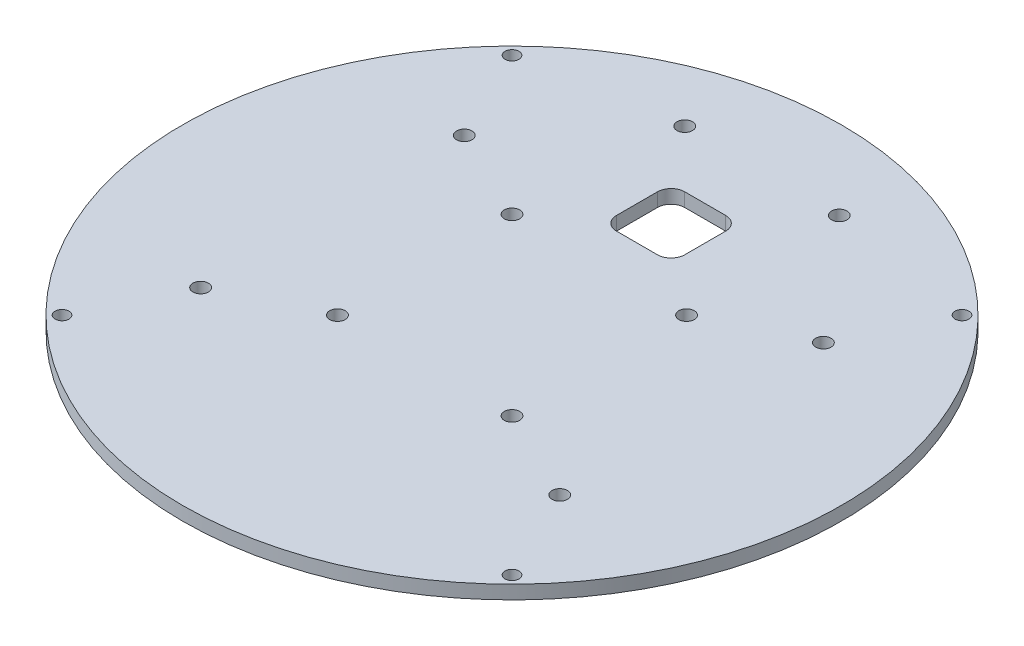
ISO-10303-21;
HEADER;
FILE_DESCRIPTION(('STEP AP214'),'2;1');
FILE_NAME('part.step','',(''),(''),'','','');
FILE_SCHEMA(('AUTOMOTIVE_DESIGN { 1 0 10303 214 1 1 1 1 }'));
ENDSEC;
DATA;
#1=APPLICATION_CONTEXT('core data for automotive mechanical design processes');
#2=APPLICATION_PROTOCOL_DEFINITION('international standard','automotive_design',2000,#1);
#3=PRODUCT_CONTEXT('',#1,'mechanical');
#4=PRODUCT('Part','Part','',(#3));
#5=PRODUCT_RELATED_PRODUCT_CATEGORY('part','',(#4));
#6=PRODUCT_DEFINITION_FORMATION('','',#4);
#7=PRODUCT_DEFINITION_CONTEXT('part definition',#1,'design');
#8=PRODUCT_DEFINITION('design','',#6,#7);
#9=PRODUCT_DEFINITION_SHAPE('','',#8);
#10=(LENGTH_UNIT() NAMED_UNIT(*) SI_UNIT(.MILLI.,.METRE.));
#11=(NAMED_UNIT(*) PLANE_ANGLE_UNIT() SI_UNIT($,.RADIAN.));
#12=(NAMED_UNIT(*) SI_UNIT($,.STERADIAN.) SOLID_ANGLE_UNIT());
#13=UNCERTAINTY_MEASURE_WITH_UNIT(LENGTH_MEASURE(1.E-05),#10,'distance_accuracy_value','');
#14=(GEOMETRIC_REPRESENTATION_CONTEXT(3) GLOBAL_UNCERTAINTY_ASSIGNED_CONTEXT((#13)) GLOBAL_UNIT_ASSIGNED_CONTEXT((#10,
#11,#12)) REPRESENTATION_CONTEXT('',''));
#15=CARTESIAN_POINT('',(0.,0.,0.));
#16=DIRECTION('',(0.,0.,1.));
#17=DIRECTION('',(1.,0.,0.));
#18=AXIS2_PLACEMENT_3D('',#15,#16,#17);
#19=CARTESIAN_POINT('',(0.,3.,0.));
#20=DIRECTION('',(0.,1.,0.));
#21=DIRECTION('',(0.,0.,1.));
#22=AXIS2_PLACEMENT_3D('',#19,#20,#21);
#23=PLANE('',#22);
#24=CARTESIAN_POINT('',(19.2,3.,19.2000000000001));
#25=DIRECTION('',(0.,1.,0.));
#26=DIRECTION('',(0.,0.,1.));
#27=AXIS2_PLACEMENT_3D('',#24,#25,#26);
#28=CIRCLE('',#27,1.70000000000013);
#29=CARTESIAN_POINT('',(19.2,3.,20.9000000000003));
#30=VERTEX_POINT('',#29);
#31=EDGE_CURVE('E176',#30,#30,#28,.T.);
#32=ORIENTED_EDGE('',*,*,#31,.F.);
#33=EDGE_LOOP('',(#32));
#34=FACE_BOUND('',#33,.T.);
#35=CARTESIAN_POINT('',(-19.2,3.,-19.2));
#36=DIRECTION('',(0.,1.,0.));
#37=DIRECTION('',(0.,0.,1.));
#38=AXIS2_PLACEMENT_3D('',#35,#36,#37);
#39=CIRCLE('',#38,1.7);
#40=CARTESIAN_POINT('',(-19.2,3.,-17.5));
#41=VERTEX_POINT('',#40);
#42=EDGE_CURVE('E188',#41,#41,#39,.T.);
#43=ORIENTED_EDGE('',*,*,#42,.F.);
#44=EDGE_LOOP('',(#43));
#45=FACE_BOUND('',#44,.T.);
#46=CARTESIAN_POINT('',(-39.4999999999994,3.,29.));
#47=DIRECTION('',(0.,1.,0.));
#48=DIRECTION('',(0.,0.,1.));
#49=AXIS2_PLACEMENT_3D('',#46,#47,#48);
#50=CIRCLE('',#49,1.7);
#51=CARTESIAN_POINT('',(-39.4999999999994,3.,30.7));
#52=VERTEX_POINT('',#51);
#53=EDGE_CURVE('E200',#52,#52,#50,.T.);
#54=ORIENTED_EDGE('',*,*,#53,.F.);
#55=EDGE_LOOP('',(#54));
#56=FACE_BOUND('',#55,.T.);
#57=CARTESIAN_POINT('',(39.5,3.,-29.));
#58=DIRECTION('',(0.,1.,0.));
#59=DIRECTION('',(0.,0.,1.));
#60=AXIS2_PLACEMENT_3D('',#57,#58,#59);
#61=CIRCLE('',#60,1.7);
#62=CARTESIAN_POINT('',(39.5,3.,-27.3));
#63=VERTEX_POINT('',#62);
#64=EDGE_CURVE('E212',#63,#63,#61,.T.);
#65=ORIENTED_EDGE('',*,*,#64,.F.);
#66=EDGE_LOOP('',(#65));
#67=FACE_BOUND('',#66,.T.);
#68=CARTESIAN_POINT('',(-39.5,3.,-29.));
#69=DIRECTION('',(0.,1.,0.));
#70=DIRECTION('',(0.,0.,1.));
#71=AXIS2_PLACEMENT_3D('',#68,#69,#70);
#72=CIRCLE('',#71,1.7);
#73=CARTESIAN_POINT('',(-39.5,3.,-27.3));
#74=VERTEX_POINT('',#73);
#75=EDGE_CURVE('E224',#74,#74,#72,.T.);
#76=ORIENTED_EDGE('',*,*,#75,.F.);
#77=EDGE_LOOP('',(#76));
#78=FACE_BOUND('',#77,.T.);
#79=CARTESIAN_POINT('',(49.4974746830589,3.,-49.4974746830577));
#80=DIRECTION('',(0.,1.,0.));
#81=DIRECTION('',(0.,0.,1.));
#82=AXIS2_PLACEMENT_3D('',#79,#80,#81);
#83=CIRCLE('',#82,1.53125044274189);
#84=CARTESIAN_POINT('',(49.4974746830589,3.,-47.9662242403159));
#85=VERTEX_POINT('',#84);
#86=EDGE_CURVE('E236',#85,#85,#83,.T.);
#87=ORIENTED_EDGE('',*,*,#86,.F.);
#88=EDGE_LOOP('',(#87));
#89=FACE_BOUND('',#88,.T.);
#90=CARTESIAN_POINT('',(-49.4974746830589,3.,49.4974746830577));
#91=DIRECTION('',(0.,1.,0.));
#92=DIRECTION('',(0.,0.,1.));
#93=AXIS2_PLACEMENT_3D('',#90,#91,#92);
#94=CIRCLE('',#93,1.53125044274189);
#95=CARTESIAN_POINT('',(-49.4974746830589,3.,51.0287251257996));
#96=VERTEX_POINT('',#95);
#97=EDGE_CURVE('E248',#96,#96,#94,.T.);
#98=ORIENTED_EDGE('',*,*,#97,.F.);
#99=EDGE_LOOP('',(#98));
#100=FACE_BOUND('',#99,.T.);
#101=CARTESIAN_POINT('',(0.,3.,0.));
#102=DIRECTION('',(0.,1.,0.));
#103=DIRECTION('',(0.,0.,1.));
#104=AXIS2_PLACEMENT_3D('',#101,#102,#103);
#105=CIRCLE('',#104,72.5);
#106=CARTESIAN_POINT('',(0.,3.,72.5));
#107=VERTEX_POINT('',#106);
#108=EDGE_CURVE('E11',#107,#107,#105,.T.);
#109=ORIENTED_EDGE('',*,*,#108,.T.);
#110=EDGE_LOOP('',(#109));
#111=FACE_BOUND('',#110,.T.);
#112=CARTESIAN_POINT('',(-49.4974746830577,3.,-49.4974746830589));
#113=DIRECTION('',(0.,1.,0.));
#114=DIRECTION('',(0.,0.,1.));
#115=AXIS2_PLACEMENT_3D('',#112,#113,#114);
#116=CIRCLE('',#115,1.53125044274189);
#117=CARTESIAN_POINT('',(-49.4974746830577,3.,-47.966224240317));
#118=VERTEX_POINT('',#117);
#119=EDGE_CURVE('E242',#118,#118,#116,.T.);
#120=ORIENTED_EDGE('',*,*,#119,.F.);
#121=EDGE_LOOP('',(#120));
#122=FACE_BOUND('',#121,.T.);
#123=CARTESIAN_POINT('',(49.4974746830577,3.,49.4974746830589));
#124=DIRECTION('',(0.,1.,0.));
#125=DIRECTION('',(0.,0.,1.));
#126=AXIS2_PLACEMENT_3D('',#123,#124,#125);
#127=CIRCLE('',#126,1.53125044274189);
#128=CARTESIAN_POINT('',(49.4974746830577,3.,51.0287251258008));
#129=VERTEX_POINT('',#128);
#130=EDGE_CURVE('E230',#129,#129,#127,.T.);
#131=ORIENTED_EDGE('',*,*,#130,.F.);
#132=EDGE_LOOP('',(#131));
#133=FACE_BOUND('',#132,.T.);
#134=CARTESIAN_POINT('',(-17.,3.,-55.));
#135=DIRECTION('',(0.,1.,0.));
#136=DIRECTION('',(0.,0.,1.));
#137=AXIS2_PLACEMENT_3D('',#134,#135,#136);
#138=CIRCLE('',#137,1.7);
#139=CARTESIAN_POINT('',(-17.,3.,-53.3));
#140=VERTEX_POINT('',#139);
#141=EDGE_CURVE('E218',#140,#140,#138,.T.);
#142=ORIENTED_EDGE('',*,*,#141,.F.);
#143=EDGE_LOOP('',(#142));
#144=FACE_BOUND('',#143,.T.);
#145=CARTESIAN_POINT('',(39.5000000000006,3.,29.));
#146=DIRECTION('',(0.,1.,0.));
#147=DIRECTION('',(0.,0.,1.));
#148=AXIS2_PLACEMENT_3D('',#145,#146,#147);
#149=CIRCLE('',#148,1.7);
#150=CARTESIAN_POINT('',(39.5000000000006,3.,30.7));
#151=VERTEX_POINT('',#150);
#152=EDGE_CURVE('E206',#151,#151,#149,.T.);
#153=ORIENTED_EDGE('',*,*,#152,.F.);
#154=EDGE_LOOP('',(#153));
#155=FACE_BOUND('',#154,.T.);
#156=CARTESIAN_POINT('',(16.9999999999999,3.,-55.));
#157=DIRECTION('',(0.,1.,0.));
#158=DIRECTION('',(0.,0.,1.));
#159=AXIS2_PLACEMENT_3D('',#156,#157,#158);
#160=CIRCLE('',#159,1.7);
#161=CARTESIAN_POINT('',(16.9999999999999,3.,-53.3));
#162=VERTEX_POINT('',#161);
#163=EDGE_CURVE('E194',#162,#162,#160,.T.);
#164=ORIENTED_EDGE('',*,*,#163,.F.);
#165=EDGE_LOOP('',(#164));
#166=FACE_BOUND('',#165,.T.);
#167=CARTESIAN_POINT('',(19.2000000000001,3.,-19.1999999999999));
#168=DIRECTION('',(0.,1.,0.));
#169=DIRECTION('',(0.,0.,1.));
#170=AXIS2_PLACEMENT_3D('',#167,#168,#169);
#171=CIRCLE('',#170,1.7);
#172=CARTESIAN_POINT('',(19.2000000000001,3.,-17.4999999999999));
#173=VERTEX_POINT('',#172);
#174=EDGE_CURVE('E182',#173,#173,#171,.T.);
#175=ORIENTED_EDGE('',*,*,#174,.F.);
#176=EDGE_LOOP('',(#175));
#177=FACE_BOUND('',#176,.T.);
#178=CARTESIAN_POINT('',(-19.2000000000002,3.,19.1999999999998));
#179=DIRECTION('',(0.,1.,0.));
#180=DIRECTION('',(0.,0.,1.));
#181=AXIS2_PLACEMENT_3D('',#178,#179,#180);
#182=CIRCLE('',#181,1.7);
#183=CARTESIAN_POINT('',(-19.2000000000002,3.,20.8999999999998));
#184=VERTEX_POINT('',#183);
#185=EDGE_CURVE('E170',#184,#184,#182,.T.);
#186=ORIENTED_EDGE('',*,*,#185,.F.);
#187=EDGE_LOOP('',(#186));
#188=FACE_BOUND('',#187,.T.);
#189=DIRECTION('',(0.,0.,1.));
#190=VECTOR('',#189,1.);
#191=CARTESIAN_POINT('',(-7.50000000000001,3.,-39.5));
#192=LINE('',#191,#190);
#193=CARTESIAN_POINT('',(-7.50000000000001,3.,-39.5));
#194=VERTEX_POINT('',#193);
#195=CARTESIAN_POINT('',(-7.50000000000001,3.,-30.5));
#196=VERTEX_POINT('',#195);
#197=EDGE_CURVE('E113',#194,#196,#192,.T.);
#198=ORIENTED_EDGE('',*,*,#197,.F.);
#199=CARTESIAN_POINT('',(-4.50000000000001,3.,-39.5));
#200=DIRECTION('',(0.,1.,0.));
#201=DIRECTION('',(0.,0.,1.));
#202=AXIS2_PLACEMENT_3D('',#199,#200,#201);
#203=CIRCLE('',#202,3.);
#204=CARTESIAN_POINT('',(-4.50000000000001,3.,-42.5));
#205=VERTEX_POINT('',#204);
#206=EDGE_CURVE('E105',#205,#194,#203,.T.);
#207=ORIENTED_EDGE('',*,*,#206,.F.);
#208=DIRECTION('',(-1.,0.,0.));
#209=VECTOR('',#208,1.);
#210=CARTESIAN_POINT('',(-4.50000000000001,3.,-42.5));
#211=LINE('',#210,#209);
#212=CARTESIAN_POINT('',(4.49999999999999,3.,-42.5));
#213=VERTEX_POINT('',#212);
#214=EDGE_CURVE('E138',#213,#205,#211,.T.);
#215=ORIENTED_EDGE('',*,*,#214,.F.);
#216=CARTESIAN_POINT('',(4.49999999999999,3.,-39.5));
#217=DIRECTION('',(0.,1.,0.));
#218=DIRECTION('',(0.,0.,1.));
#219=AXIS2_PLACEMENT_3D('',#216,#217,#218);
#220=CIRCLE('',#219,3.);
#221=CARTESIAN_POINT('',(7.49999999999999,3.,-39.5));
#222=VERTEX_POINT('',#221);
#223=EDGE_CURVE('E136',#222,#213,#220,.T.);
#224=ORIENTED_EDGE('',*,*,#223,.F.);
#225=DIRECTION('',(0.,0.,-1.));
#226=VECTOR('',#225,1.);
#227=CARTESIAN_POINT('',(7.49999999999999,3.,-39.5));
#228=LINE('',#227,#226);
#229=CARTESIAN_POINT('',(7.49999999999999,3.,-30.5));
#230=VERTEX_POINT('',#229);
#231=EDGE_CURVE('E134',#230,#222,#228,.T.);
#232=ORIENTED_EDGE('',*,*,#231,.F.);
#233=CARTESIAN_POINT('',(4.49999999999999,3.,-30.5));
#234=DIRECTION('',(0.,1.,0.));
#235=DIRECTION('',(0.,0.,-1.));
#236=AXIS2_PLACEMENT_3D('',#233,#234,#235);
#237=CIRCLE('',#236,3.);
#238=CARTESIAN_POINT('',(4.49999999999999,3.,-27.5));
#239=VERTEX_POINT('',#238);
#240=EDGE_CURVE('E132',#239,#230,#237,.T.);
#241=ORIENTED_EDGE('',*,*,#240,.F.);
#242=DIRECTION('',(1.,0.,0.));
#243=VECTOR('',#242,1.);
#244=CARTESIAN_POINT('',(-4.50000000000001,3.,-27.5));
#245=LINE('',#244,#243);
#246=CARTESIAN_POINT('',(-4.50000000000001,3.,-27.5));
#247=VERTEX_POINT('',#246);
#248=EDGE_CURVE('E128',#247,#239,#245,.T.);
#249=ORIENTED_EDGE('',*,*,#248,.F.);
#250=CARTESIAN_POINT('',(-4.50000000000001,3.,-30.5));
#251=DIRECTION('',(0.,1.,0.));
#252=DIRECTION('',(0.,0.,1.));
#253=AXIS2_PLACEMENT_3D('',#250,#251,#252);
#254=CIRCLE('',#253,3.);
#255=EDGE_CURVE('E126',#196,#247,#254,.T.);
#256=ORIENTED_EDGE('',*,*,#255,.F.);
#257=EDGE_LOOP('',(#198,#207,#215,#224,#232,#241,#249,#256));
#258=FACE_BOUND('',#257,.T.);
#259=ADVANCED_FACE('F40',(#34,#45,#56,#67,#78,#89,#100,#111,#122,#133,#144,#155,#166,#177,#188,
#258),#23,.T.);
#260=CARTESIAN_POINT('',(0.,0.,0.));
#261=DIRECTION('',(0.,1.,0.));
#262=DIRECTION('',(0.,0.,1.));
#263=AXIS2_PLACEMENT_3D('',#260,#261,#262);
#264=PLANE('',#263);
#265=CARTESIAN_POINT('',(-19.2000000000002,0.,19.1999999999998));
#266=DIRECTION('',(0.,1.,0.));
#267=DIRECTION('',(0.,0.,1.));
#268=AXIS2_PLACEMENT_3D('',#265,#266,#267);
#269=CIRCLE('',#268,1.7);
#270=CARTESIAN_POINT('',(-19.2000000000002,0.,20.8999999999998));
#271=VERTEX_POINT('',#270);
#272=EDGE_CURVE('E121',#271,#271,#269,.T.);
#273=ORIENTED_EDGE('',*,*,#272,.T.);
#274=EDGE_LOOP('',(#273));
#275=FACE_BOUND('',#274,.T.);
#276=CARTESIAN_POINT('',(19.2,0.,19.2000000000001));
#277=DIRECTION('',(0.,1.,0.));
#278=DIRECTION('',(0.,0.,1.));
#279=AXIS2_PLACEMENT_3D('',#276,#277,#278);
#280=CIRCLE('',#279,1.70000000000013);
#281=CARTESIAN_POINT('',(19.2,0.,20.9000000000003));
#282=VERTEX_POINT('',#281);
#283=EDGE_CURVE('E173',#282,#282,#280,.T.);
#284=ORIENTED_EDGE('',*,*,#283,.T.);
#285=EDGE_LOOP('',(#284));
#286=FACE_BOUND('',#285,.T.);
#287=CARTESIAN_POINT('',(19.2000000000001,0.,-19.1999999999999));
#288=DIRECTION('',(0.,1.,0.));
#289=DIRECTION('',(0.,0.,1.));
#290=AXIS2_PLACEMENT_3D('',#287,#288,#289);
#291=CIRCLE('',#290,1.7);
#292=CARTESIAN_POINT('',(19.2000000000001,0.,-17.4999999999999));
#293=VERTEX_POINT('',#292);
#294=EDGE_CURVE('E179',#293,#293,#291,.T.);
#295=ORIENTED_EDGE('',*,*,#294,.T.);
#296=EDGE_LOOP('',(#295));
#297=FACE_BOUND('',#296,.T.);
#298=CARTESIAN_POINT('',(-19.2,0.,-19.2));
#299=DIRECTION('',(0.,1.,0.));
#300=DIRECTION('',(0.,0.,1.));
#301=AXIS2_PLACEMENT_3D('',#298,#299,#300);
#302=CIRCLE('',#301,1.7);
#303=CARTESIAN_POINT('',(-19.2,0.,-17.5));
#304=VERTEX_POINT('',#303);
#305=EDGE_CURVE('E185',#304,#304,#302,.T.);
#306=ORIENTED_EDGE('',*,*,#305,.T.);
#307=EDGE_LOOP('',(#306));
#308=FACE_BOUND('',#307,.T.);
#309=CARTESIAN_POINT('',(16.9999999999999,0.,-55.));
#310=DIRECTION('',(0.,1.,0.));
#311=DIRECTION('',(0.,0.,1.));
#312=AXIS2_PLACEMENT_3D('',#309,#310,#311);
#313=CIRCLE('',#312,1.7);
#314=CARTESIAN_POINT('',(16.9999999999999,0.,-53.3));
#315=VERTEX_POINT('',#314);
#316=EDGE_CURVE('E191',#315,#315,#313,.T.);
#317=ORIENTED_EDGE('',*,*,#316,.T.);
#318=EDGE_LOOP('',(#317));
#319=FACE_BOUND('',#318,.T.);
#320=CARTESIAN_POINT('',(-39.4999999999994,0.,29.));
#321=DIRECTION('',(0.,1.,0.));
#322=DIRECTION('',(0.,0.,1.));
#323=AXIS2_PLACEMENT_3D('',#320,#321,#322);
#324=CIRCLE('',#323,1.7);
#325=CARTESIAN_POINT('',(-39.4999999999994,0.,30.7));
#326=VERTEX_POINT('',#325);
#327=EDGE_CURVE('E197',#326,#326,#324,.T.);
#328=ORIENTED_EDGE('',*,*,#327,.T.);
#329=EDGE_LOOP('',(#328));
#330=FACE_BOUND('',#329,.T.);
#331=CARTESIAN_POINT('',(39.5000000000006,0.,29.));
#332=DIRECTION('',(0.,1.,0.));
#333=DIRECTION('',(0.,0.,1.));
#334=AXIS2_PLACEMENT_3D('',#331,#332,#333);
#335=CIRCLE('',#334,1.7);
#336=CARTESIAN_POINT('',(39.5000000000006,0.,30.7));
#337=VERTEX_POINT('',#336);
#338=EDGE_CURVE('E203',#337,#337,#335,.T.);
#339=ORIENTED_EDGE('',*,*,#338,.T.);
#340=EDGE_LOOP('',(#339));
#341=FACE_BOUND('',#340,.T.);
#342=CARTESIAN_POINT('',(39.5,0.,-29.));
#343=DIRECTION('',(0.,1.,0.));
#344=DIRECTION('',(0.,0.,1.));
#345=AXIS2_PLACEMENT_3D('',#342,#343,#344);
#346=CIRCLE('',#345,1.7);
#347=CARTESIAN_POINT('',(39.5,0.,-27.3));
#348=VERTEX_POINT('',#347);
#349=EDGE_CURVE('E209',#348,#348,#346,.T.);
#350=ORIENTED_EDGE('',*,*,#349,.T.);
#351=EDGE_LOOP('',(#350));
#352=FACE_BOUND('',#351,.T.);
#353=CARTESIAN_POINT('',(-17.,0.,-55.));
#354=DIRECTION('',(0.,1.,0.));
#355=DIRECTION('',(0.,0.,1.));
#356=AXIS2_PLACEMENT_3D('',#353,#354,#355);
#357=CIRCLE('',#356,1.7);
#358=CARTESIAN_POINT('',(-17.,0.,-53.3));
#359=VERTEX_POINT('',#358);
#360=EDGE_CURVE('E215',#359,#359,#357,.T.);
#361=ORIENTED_EDGE('',*,*,#360,.T.);
#362=EDGE_LOOP('',(#361));
#363=FACE_BOUND('',#362,.T.);
#364=CARTESIAN_POINT('',(-39.5,0.,-29.));
#365=DIRECTION('',(0.,1.,0.));
#366=DIRECTION('',(0.,0.,1.));
#367=AXIS2_PLACEMENT_3D('',#364,#365,#366);
#368=CIRCLE('',#367,1.7);
#369=CARTESIAN_POINT('',(-39.5,0.,-27.3));
#370=VERTEX_POINT('',#369);
#371=EDGE_CURVE('E221',#370,#370,#368,.T.);
#372=ORIENTED_EDGE('',*,*,#371,.T.);
#373=EDGE_LOOP('',(#372));
#374=FACE_BOUND('',#373,.T.);
#375=CARTESIAN_POINT('',(49.4974746830577,0.,49.4974746830589));
#376=DIRECTION('',(0.,1.,0.));
#377=DIRECTION('',(0.,0.,1.));
#378=AXIS2_PLACEMENT_3D('',#375,#376,#377);
#379=CIRCLE('',#378,1.53125044274189);
#380=CARTESIAN_POINT('',(49.4974746830577,0.,51.0287251258008));
#381=VERTEX_POINT('',#380);
#382=EDGE_CURVE('E227',#381,#381,#379,.T.);
#383=ORIENTED_EDGE('',*,*,#382,.T.);
#384=EDGE_LOOP('',(#383));
#385=FACE_BOUND('',#384,.T.);
#386=CARTESIAN_POINT('',(49.4974746830589,0.,-49.4974746830577));
#387=DIRECTION('',(0.,1.,0.));
#388=DIRECTION('',(0.,0.,1.));
#389=AXIS2_PLACEMENT_3D('',#386,#387,#388);
#390=CIRCLE('',#389,1.53125044274189);
#391=CARTESIAN_POINT('',(49.4974746830589,0.,-47.9662242403159));
#392=VERTEX_POINT('',#391);
#393=EDGE_CURVE('E233',#392,#392,#390,.T.);
#394=ORIENTED_EDGE('',*,*,#393,.T.);
#395=EDGE_LOOP('',(#394));
#396=FACE_BOUND('',#395,.T.);
#397=CARTESIAN_POINT('',(-49.4974746830577,0.,-49.4974746830589));
#398=DIRECTION('',(0.,1.,0.));
#399=DIRECTION('',(0.,0.,1.));
#400=AXIS2_PLACEMENT_3D('',#397,#398,#399);
#401=CIRCLE('',#400,1.53125044274189);
#402=CARTESIAN_POINT('',(-49.4974746830577,0.,-47.966224240317));
#403=VERTEX_POINT('',#402);
#404=EDGE_CURVE('E239',#403,#403,#401,.T.);
#405=ORIENTED_EDGE('',*,*,#404,.T.);
#406=EDGE_LOOP('',(#405));
#407=FACE_BOUND('',#406,.T.);
#408=CARTESIAN_POINT('',(-49.4974746830589,0.,49.4974746830577));
#409=DIRECTION('',(0.,1.,0.));
#410=DIRECTION('',(0.,0.,1.));
#411=AXIS2_PLACEMENT_3D('',#408,#409,#410);
#412=CIRCLE('',#411,1.53125044274189);
#413=CARTESIAN_POINT('',(-49.4974746830589,0.,51.0287251257996));
#414=VERTEX_POINT('',#413);
#415=EDGE_CURVE('E245',#414,#414,#412,.T.);
#416=ORIENTED_EDGE('',*,*,#415,.T.);
#417=EDGE_LOOP('',(#416));
#418=FACE_BOUND('',#417,.T.);
#419=CARTESIAN_POINT('',(0.,0.,0.));
#420=DIRECTION('',(0.,1.,0.));
#421=DIRECTION('',(0.,0.,1.));
#422=AXIS2_PLACEMENT_3D('',#419,#420,#421);
#423=CIRCLE('',#422,72.5);
#424=CARTESIAN_POINT('',(0.,0.,72.5));
#425=VERTEX_POINT('',#424);
#426=EDGE_CURVE('E44',#425,#425,#423,.T.);
#427=ORIENTED_EDGE('',*,*,#426,.F.);
#428=EDGE_LOOP('',(#427));
#429=FACE_BOUND('',#428,.T.);
#430=CARTESIAN_POINT('',(-4.50000000000001,0.,-39.5));
#431=DIRECTION('',(0.,1.,0.));
#432=DIRECTION('',(0.,0.,1.));
#433=AXIS2_PLACEMENT_3D('',#430,#431,#432);
#434=CIRCLE('',#433,3.);
#435=CARTESIAN_POINT('',(-4.50000000000001,0.,-42.5));
#436=VERTEX_POINT('',#435);
#437=CARTESIAN_POINT('',(-7.50000000000001,0.,-39.5));
#438=VERTEX_POINT('',#437);
#439=EDGE_CURVE('E63',#436,#438,#434,.T.);
#440=ORIENTED_EDGE('',*,*,#439,.T.);
#441=DIRECTION('',(0.,0.,1.));
#442=VECTOR('',#441,1.);
#443=CARTESIAN_POINT('',(-7.50000000000001,0.,-39.5));
#444=LINE('',#443,#442);
#445=CARTESIAN_POINT('',(-7.50000000000001,0.,-30.5));
#446=VERTEX_POINT('',#445);
#447=EDGE_CURVE('E120',#438,#446,#444,.T.);
#448=ORIENTED_EDGE('',*,*,#447,.T.);
#449=CARTESIAN_POINT('',(-4.50000000000001,0.,-30.5));
#450=DIRECTION('',(0.,1.,0.));
#451=DIRECTION('',(0.,0.,1.));
#452=AXIS2_PLACEMENT_3D('',#449,#450,#451);
#453=CIRCLE('',#452,3.);
#454=CARTESIAN_POINT('',(-4.50000000000001,0.,-27.5));
#455=VERTEX_POINT('',#454);
#456=EDGE_CURVE('E142',#446,#455,#453,.T.);
#457=ORIENTED_EDGE('',*,*,#456,.T.);
#458=DIRECTION('',(1.,0.,0.));
#459=VECTOR('',#458,1.);
#460=CARTESIAN_POINT('',(-4.50000000000001,0.,-27.5));
#461=LINE('',#460,#459);
#462=CARTESIAN_POINT('',(4.49999999999999,0.,-27.5));
#463=VERTEX_POINT('',#462);
#464=EDGE_CURVE('E145',#455,#463,#461,.T.);
#465=ORIENTED_EDGE('',*,*,#464,.T.);
#466=CARTESIAN_POINT('',(4.49999999999999,0.,-30.5));
#467=DIRECTION('',(0.,1.,0.));
#468=DIRECTION('',(0.,0.,-1.));
#469=AXIS2_PLACEMENT_3D('',#466,#467,#468);
#470=CIRCLE('',#469,3.);
#471=CARTESIAN_POINT('',(7.49999999999999,0.,-30.5));
#472=VERTEX_POINT('',#471);
#473=EDGE_CURVE('E148',#463,#472,#470,.T.);
#474=ORIENTED_EDGE('',*,*,#473,.T.);
#475=DIRECTION('',(0.,0.,-1.));
#476=VECTOR('',#475,1.);
#477=CARTESIAN_POINT('',(7.49999999999999,0.,-39.5));
#478=LINE('',#477,#476);
#479=CARTESIAN_POINT('',(7.49999999999999,0.,-39.5));
#480=VERTEX_POINT('',#479);
#481=EDGE_CURVE('E151',#472,#480,#478,.T.);
#482=ORIENTED_EDGE('',*,*,#481,.T.);
#483=CARTESIAN_POINT('',(4.49999999999999,0.,-39.5));
#484=DIRECTION('',(0.,1.,0.));
#485=DIRECTION('',(0.,0.,1.));
#486=AXIS2_PLACEMENT_3D('',#483,#484,#485);
#487=CIRCLE('',#486,3.);
#488=CARTESIAN_POINT('',(4.49999999999999,0.,-42.5));
#489=VERTEX_POINT('',#488);
#490=EDGE_CURVE('E154',#480,#489,#487,.T.);
#491=ORIENTED_EDGE('',*,*,#490,.T.);
#492=DIRECTION('',(-1.,0.,0.));
#493=VECTOR('',#492,1.);
#494=CARTESIAN_POINT('',(-4.50000000000001,0.,-42.5));
#495=LINE('',#494,#493);
#496=EDGE_CURVE('E114',#489,#436,#495,.T.);
#497=ORIENTED_EDGE('',*,*,#496,.T.);
#498=EDGE_LOOP('',(#440,#448,#457,#465,#474,#482,#491,#497));
#499=FACE_BOUND('',#498,.T.);
#500=ADVANCED_FACE('F254',(#275,#286,#297,#308,#319,#330,#341,#352,#363,#374,#385,#396,#407,
#418,#429,#499),#264,.F.);
#501=CARTESIAN_POINT('',(0.,3.,0.));
#502=DIRECTION('',(0.,-1.,0.));
#503=DIRECTION('',(0.,0.,-1.));
#504=AXIS2_PLACEMENT_3D('',#501,#502,#503);
#505=CYLINDRICAL_SURFACE('',#504,72.5);
#506=ORIENTED_EDGE('',*,*,#108,.F.);
#507=EDGE_LOOP('',(#506));
#508=FACE_BOUND('',#507,.T.);
#509=ORIENTED_EDGE('',*,*,#426,.T.);
#510=EDGE_LOOP('',(#509));
#511=FACE_BOUND('',#510,.T.);
#512=ADVANCED_FACE('F42',(#508,#511),#505,.T.);
#513=CARTESIAN_POINT('',(-49.4974746830589,3.,49.4974746830577));
#514=DIRECTION('',(0.,-1.,0.));
#515=DIRECTION('',(0.,0.,-1.));
#516=AXIS2_PLACEMENT_3D('',#513,#514,#515);
#517=CYLINDRICAL_SURFACE('',#516,1.53125044274189);
#518=ORIENTED_EDGE('',*,*,#97,.T.);
#519=EDGE_LOOP('',(#518));
#520=FACE_BOUND('',#519,.T.);
#521=ORIENTED_EDGE('',*,*,#415,.F.);
#522=EDGE_LOOP('',(#521));
#523=FACE_BOUND('',#522,.T.);
#524=ADVANCED_FACE('F257',(#520,#523),#517,.F.);
#525=CARTESIAN_POINT('',(-49.4974746830577,3.,-49.4974746830589));
#526=DIRECTION('',(0.,-1.,0.));
#527=DIRECTION('',(0.,0.,-1.));
#528=AXIS2_PLACEMENT_3D('',#525,#526,#527);
#529=CYLINDRICAL_SURFACE('',#528,1.53125044274189);
#530=ORIENTED_EDGE('',*,*,#119,.T.);
#531=EDGE_LOOP('',(#530));
#532=FACE_BOUND('',#531,.T.);
#533=ORIENTED_EDGE('',*,*,#404,.F.);
#534=EDGE_LOOP('',(#533));
#535=FACE_BOUND('',#534,.T.);
#536=ADVANCED_FACE('F259',(#532,#535),#529,.F.);
#537=CARTESIAN_POINT('',(49.4974746830589,3.,-49.4974746830577));
#538=DIRECTION('',(0.,-1.,0.));
#539=DIRECTION('',(0.,0.,-1.));
#540=AXIS2_PLACEMENT_3D('',#537,#538,#539);
#541=CYLINDRICAL_SURFACE('',#540,1.53125044274189);
#542=ORIENTED_EDGE('',*,*,#86,.T.);
#543=EDGE_LOOP('',(#542));
#544=FACE_BOUND('',#543,.T.);
#545=ORIENTED_EDGE('',*,*,#393,.F.);
#546=EDGE_LOOP('',(#545));
#547=FACE_BOUND('',#546,.T.);
#548=ADVANCED_FACE('F266',(#544,#547),#541,.F.);
#549=CARTESIAN_POINT('',(49.4974746830577,3.,49.4974746830589));
#550=DIRECTION('',(0.,-1.,0.));
#551=DIRECTION('',(0.,0.,-1.));
#552=AXIS2_PLACEMENT_3D('',#549,#550,#551);
#553=CYLINDRICAL_SURFACE('',#552,1.53125044274189);
#554=ORIENTED_EDGE('',*,*,#130,.T.);
#555=EDGE_LOOP('',(#554));
#556=FACE_BOUND('',#555,.T.);
#557=ORIENTED_EDGE('',*,*,#382,.F.);
#558=EDGE_LOOP('',(#557));
#559=FACE_BOUND('',#558,.T.);
#560=ADVANCED_FACE('F340',(#556,#559),#553,.F.);
#561=CARTESIAN_POINT('',(-39.5,3.,-29.));
#562=DIRECTION('',(0.,-1.,0.));
#563=DIRECTION('',(0.,0.,-1.));
#564=AXIS2_PLACEMENT_3D('',#561,#562,#563);
#565=CYLINDRICAL_SURFACE('',#564,1.7);
#566=ORIENTED_EDGE('',*,*,#75,.T.);
#567=EDGE_LOOP('',(#566));
#568=FACE_BOUND('',#567,.T.);
#569=ORIENTED_EDGE('',*,*,#371,.F.);
#570=EDGE_LOOP('',(#569));
#571=FACE_BOUND('',#570,.T.);
#572=ADVANCED_FACE('F346',(#568,#571),#565,.F.);
#573=CARTESIAN_POINT('',(-17.,3.,-55.));
#574=DIRECTION('',(0.,-1.,0.));
#575=DIRECTION('',(0.,0.,-1.));
#576=AXIS2_PLACEMENT_3D('',#573,#574,#575);
#577=CYLINDRICAL_SURFACE('',#576,1.7);
#578=ORIENTED_EDGE('',*,*,#141,.T.);
#579=EDGE_LOOP('',(#578));
#580=FACE_BOUND('',#579,.T.);
#581=ORIENTED_EDGE('',*,*,#360,.F.);
#582=EDGE_LOOP('',(#581));
#583=FACE_BOUND('',#582,.T.);
#584=ADVANCED_FACE('F352',(#580,#583),#577,.F.);
#585=CARTESIAN_POINT('',(39.5,3.,-29.));
#586=DIRECTION('',(0.,-1.,0.));
#587=DIRECTION('',(0.,0.,-1.));
#588=AXIS2_PLACEMENT_3D('',#585,#586,#587);
#589=CYLINDRICAL_SURFACE('',#588,1.7);
#590=ORIENTED_EDGE('',*,*,#64,.T.);
#591=EDGE_LOOP('',(#590));
#592=FACE_BOUND('',#591,.T.);
#593=ORIENTED_EDGE('',*,*,#349,.F.);
#594=EDGE_LOOP('',(#593));
#595=FACE_BOUND('',#594,.T.);
#596=ADVANCED_FACE('F356',(#592,#595),#589,.F.);
#597=CARTESIAN_POINT('',(39.5000000000006,3.,29.));
#598=DIRECTION('',(0.,-1.,0.));
#599=DIRECTION('',(0.,0.,-1.));
#600=AXIS2_PLACEMENT_3D('',#597,#598,#599);
#601=CYLINDRICAL_SURFACE('',#600,1.7);
#602=ORIENTED_EDGE('',*,*,#152,.T.);
#603=EDGE_LOOP('',(#602));
#604=FACE_BOUND('',#603,.T.);
#605=ORIENTED_EDGE('',*,*,#338,.F.);
#606=EDGE_LOOP('',(#605));
#607=FACE_BOUND('',#606,.T.);
#608=ADVANCED_FACE('F360',(#604,#607),#601,.F.);
#609=CARTESIAN_POINT('',(-39.4999999999994,3.,29.));
#610=DIRECTION('',(0.,-1.,0.));
#611=DIRECTION('',(0.,0.,-1.));
#612=AXIS2_PLACEMENT_3D('',#609,#610,#611);
#613=CYLINDRICAL_SURFACE('',#612,1.7);
#614=ORIENTED_EDGE('',*,*,#53,.T.);
#615=EDGE_LOOP('',(#614));
#616=FACE_BOUND('',#615,.T.);
#617=ORIENTED_EDGE('',*,*,#327,.F.);
#618=EDGE_LOOP('',(#617));
#619=FACE_BOUND('',#618,.T.);
#620=ADVANCED_FACE('F364',(#616,#619),#613,.F.);
#621=CARTESIAN_POINT('',(16.9999999999999,3.,-55.));
#622=DIRECTION('',(0.,-1.,0.));
#623=DIRECTION('',(0.,0.,-1.));
#624=AXIS2_PLACEMENT_3D('',#621,#622,#623);
#625=CYLINDRICAL_SURFACE('',#624,1.7);
#626=ORIENTED_EDGE('',*,*,#163,.T.);
#627=EDGE_LOOP('',(#626));
#628=FACE_BOUND('',#627,.T.);
#629=ORIENTED_EDGE('',*,*,#316,.F.);
#630=EDGE_LOOP('',(#629));
#631=FACE_BOUND('',#630,.T.);
#632=ADVANCED_FACE('F368',(#628,#631),#625,.F.);
#633=CARTESIAN_POINT('',(-19.2,3.,-19.2));
#634=DIRECTION('',(0.,-1.,0.));
#635=DIRECTION('',(0.,0.,-1.));
#636=AXIS2_PLACEMENT_3D('',#633,#634,#635);
#637=CYLINDRICAL_SURFACE('',#636,1.7);
#638=ORIENTED_EDGE('',*,*,#42,.T.);
#639=EDGE_LOOP('',(#638));
#640=FACE_BOUND('',#639,.T.);
#641=ORIENTED_EDGE('',*,*,#305,.F.);
#642=EDGE_LOOP('',(#641));
#643=FACE_BOUND('',#642,.T.);
#644=ADVANCED_FACE('F372',(#640,#643),#637,.F.);
#645=CARTESIAN_POINT('',(19.2000000000001,3.,-19.1999999999999));
#646=DIRECTION('',(0.,-1.,0.));
#647=DIRECTION('',(0.,0.,-1.));
#648=AXIS2_PLACEMENT_3D('',#645,#646,#647);
#649=CYLINDRICAL_SURFACE('',#648,1.7);
#650=ORIENTED_EDGE('',*,*,#174,.T.);
#651=EDGE_LOOP('',(#650));
#652=FACE_BOUND('',#651,.T.);
#653=ORIENTED_EDGE('',*,*,#294,.F.);
#654=EDGE_LOOP('',(#653));
#655=FACE_BOUND('',#654,.T.);
#656=ADVANCED_FACE('F376',(#652,#655),#649,.F.);
#657=CARTESIAN_POINT('',(19.2,3.,19.2000000000001));
#658=DIRECTION('',(0.,-1.,0.));
#659=DIRECTION('',(0.,0.,-1.));
#660=AXIS2_PLACEMENT_3D('',#657,#658,#659);
#661=CYLINDRICAL_SURFACE('',#660,1.70000000000013);
#662=ORIENTED_EDGE('',*,*,#31,.T.);
#663=EDGE_LOOP('',(#662));
#664=FACE_BOUND('',#663,.T.);
#665=ORIENTED_EDGE('',*,*,#283,.F.);
#666=EDGE_LOOP('',(#665));
#667=FACE_BOUND('',#666,.T.);
#668=ADVANCED_FACE('F310',(#664,#667),#661,.F.);
#669=CARTESIAN_POINT('',(-19.2000000000002,3.,19.1999999999998));
#670=DIRECTION('',(0.,-1.,0.));
#671=DIRECTION('',(0.,0.,-1.));
#672=AXIS2_PLACEMENT_3D('',#669,#670,#671);
#673=CYLINDRICAL_SURFACE('',#672,1.7);
#674=ORIENTED_EDGE('',*,*,#185,.T.);
#675=EDGE_LOOP('',(#674));
#676=FACE_BOUND('',#675,.T.);
#677=ORIENTED_EDGE('',*,*,#272,.F.);
#678=EDGE_LOOP('',(#677));
#679=FACE_BOUND('',#678,.T.);
#680=ADVANCED_FACE('F307',(#676,#679),#673,.F.);
#681=CARTESIAN_POINT('',(-4.50000000000001,3.,-39.5));
#682=DIRECTION('',(0.,-1.,0.));
#683=DIRECTION('',(0.,0.,-1.));
#684=AXIS2_PLACEMENT_3D('',#681,#682,#683);
#685=CYLINDRICAL_SURFACE('',#684,3.);
#686=ORIENTED_EDGE('',*,*,#439,.F.);
#687=DIRECTION('',(0.,-1.,0.));
#688=VECTOR('',#687,1.);
#689=CARTESIAN_POINT('',(-4.50000000000001,3.,-42.5));
#690=LINE('',#689,#688);
#691=EDGE_CURVE('E109',#205,#436,#690,.T.);
#692=ORIENTED_EDGE('',*,*,#691,.F.);
#693=ORIENTED_EDGE('',*,*,#206,.T.);
#694=DIRECTION('',(0.,-1.,0.));
#695=VECTOR('',#694,1.);
#696=CARTESIAN_POINT('',(-7.50000000000001,3.,-39.5));
#697=LINE('',#696,#695);
#698=EDGE_CURVE('E108',#194,#438,#697,.T.);
#699=ORIENTED_EDGE('',*,*,#698,.T.);
#700=EDGE_LOOP('',(#686,#692,#693,#699));
#701=FACE_BOUND('',#700,.T.);
#702=ADVANCED_FACE('F107',(#701),#685,.F.);
#703=CARTESIAN_POINT('',(-7.50000000000001,3.,-39.5));
#704=DIRECTION('',(1.,0.,0.));
#705=DIRECTION('',(0.,0.,-1.));
#706=AXIS2_PLACEMENT_3D('',#703,#704,#705);
#707=PLANE('',#706);
#708=ORIENTED_EDGE('',*,*,#447,.F.);
#709=ORIENTED_EDGE('',*,*,#698,.F.);
#710=ORIENTED_EDGE('',*,*,#197,.T.);
#711=DIRECTION('',(0.,-1.,0.));
#712=VECTOR('',#711,1.);
#713=CARTESIAN_POINT('',(-7.50000000000001,3.,-30.5));
#714=LINE('',#713,#712);
#715=EDGE_CURVE('E122',#196,#446,#714,.T.);
#716=ORIENTED_EDGE('',*,*,#715,.T.);
#717=EDGE_LOOP('',(#708,#709,#710,#716));
#718=FACE_BOUND('',#717,.T.);
#719=ADVANCED_FACE('F117',(#718),#707,.T.);
#720=CARTESIAN_POINT('',(-4.50000000000001,3.,-30.5));
#721=DIRECTION('',(0.,-1.,0.));
#722=DIRECTION('',(0.,0.,-1.));
#723=AXIS2_PLACEMENT_3D('',#720,#721,#722);
#724=CYLINDRICAL_SURFACE('',#723,3.);
#725=ORIENTED_EDGE('',*,*,#456,.F.);
#726=ORIENTED_EDGE('',*,*,#715,.F.);
#727=ORIENTED_EDGE('',*,*,#255,.T.);
#728=DIRECTION('',(0.,-1.,0.));
#729=VECTOR('',#728,1.);
#730=CARTESIAN_POINT('',(-4.50000000000001,3.,-27.5));
#731=LINE('',#730,#729);
#732=EDGE_CURVE('E167',#247,#455,#731,.T.);
#733=ORIENTED_EDGE('',*,*,#732,.T.);
#734=EDGE_LOOP('',(#725,#726,#727,#733));
#735=FACE_BOUND('',#734,.T.);
#736=ADVANCED_FACE('F388',(#735),#724,.F.);
#737=CARTESIAN_POINT('',(-4.50000000000001,3.,-27.5));
#738=DIRECTION('',(0.,0.,-1.));
#739=DIRECTION('',(-1.,0.,0.));
#740=AXIS2_PLACEMENT_3D('',#737,#738,#739);
#741=PLANE('',#740);
#742=ORIENTED_EDGE('',*,*,#464,.F.);
#743=ORIENTED_EDGE('',*,*,#732,.F.);
#744=ORIENTED_EDGE('',*,*,#248,.T.);
#745=DIRECTION('',(0.,-1.,0.));
#746=VECTOR('',#745,1.);
#747=CARTESIAN_POINT('',(4.49999999999999,3.,-27.5));
#748=LINE('',#747,#746);
#749=EDGE_CURVE('E165',#239,#463,#748,.T.);
#750=ORIENTED_EDGE('',*,*,#749,.T.);
#751=EDGE_LOOP('',(#742,#743,#744,#750));
#752=FACE_BOUND('',#751,.T.);
#753=ADVANCED_FACE('F391',(#752),#741,.T.);
#754=CARTESIAN_POINT('',(4.49999999999999,3.,-30.5));
#755=DIRECTION('',(0.,-1.,0.));
#756=DIRECTION('',(0.,0.,-1.));
#757=AXIS2_PLACEMENT_3D('',#754,#755,#756);
#758=CYLINDRICAL_SURFACE('',#757,3.);
#759=ORIENTED_EDGE('',*,*,#473,.F.);
#760=ORIENTED_EDGE('',*,*,#749,.F.);
#761=ORIENTED_EDGE('',*,*,#240,.T.);
#762=DIRECTION('',(0.,-1.,0.));
#763=VECTOR('',#762,1.);
#764=CARTESIAN_POINT('',(7.49999999999999,3.,-30.5));
#765=LINE('',#764,#763);
#766=EDGE_CURVE('E163',#230,#472,#765,.T.);
#767=ORIENTED_EDGE('',*,*,#766,.T.);
#768=EDGE_LOOP('',(#759,#760,#761,#767));
#769=FACE_BOUND('',#768,.T.);
#770=ADVANCED_FACE('F395',(#769),#758,.F.);
#771=CARTESIAN_POINT('',(7.49999999999999,3.,-39.5));
#772=DIRECTION('',(-1.,0.,0.));
#773=DIRECTION('',(0.,0.,1.));
#774=AXIS2_PLACEMENT_3D('',#771,#772,#773);
#775=PLANE('',#774);
#776=ORIENTED_EDGE('',*,*,#481,.F.);
#777=ORIENTED_EDGE('',*,*,#766,.F.);
#778=ORIENTED_EDGE('',*,*,#231,.T.);
#779=DIRECTION('',(0.,-1.,0.));
#780=VECTOR('',#779,1.);
#781=CARTESIAN_POINT('',(7.49999999999999,3.,-39.5));
#782=LINE('',#781,#780);
#783=EDGE_CURVE('E161',#222,#480,#782,.T.);
#784=ORIENTED_EDGE('',*,*,#783,.T.);
#785=EDGE_LOOP('',(#776,#777,#778,#784));
#786=FACE_BOUND('',#785,.T.);
#787=ADVANCED_FACE('F399',(#786),#775,.T.);
#788=CARTESIAN_POINT('',(4.49999999999999,3.,-39.5));
#789=DIRECTION('',(0.,-1.,0.));
#790=DIRECTION('',(0.,0.,-1.));
#791=AXIS2_PLACEMENT_3D('',#788,#789,#790);
#792=CYLINDRICAL_SURFACE('',#791,3.);
#793=ORIENTED_EDGE('',*,*,#490,.F.);
#794=ORIENTED_EDGE('',*,*,#783,.F.);
#795=ORIENTED_EDGE('',*,*,#223,.T.);
#796=DIRECTION('',(0.,-1.,0.));
#797=VECTOR('',#796,1.);
#798=CARTESIAN_POINT('',(4.49999999999999,3.,-42.5));
#799=LINE('',#798,#797);
#800=EDGE_CURVE('E55',#213,#489,#799,.T.);
#801=ORIENTED_EDGE('',*,*,#800,.T.);
#802=EDGE_LOOP('',(#793,#794,#795,#801));
#803=FACE_BOUND('',#802,.T.);
#804=ADVANCED_FACE('F403',(#803),#792,.F.);
#805=CARTESIAN_POINT('',(-4.50000000000001,3.,-42.5));
#806=DIRECTION('',(0.,0.,1.));
#807=DIRECTION('',(1.,0.,0.));
#808=AXIS2_PLACEMENT_3D('',#805,#806,#807);
#809=PLANE('',#808);
#810=ORIENTED_EDGE('',*,*,#496,.F.);
#811=ORIENTED_EDGE('',*,*,#800,.F.);
#812=ORIENTED_EDGE('',*,*,#214,.T.);
#813=ORIENTED_EDGE('',*,*,#691,.T.);
#814=EDGE_LOOP('',(#810,#811,#812,#813));
#815=FACE_BOUND('',#814,.T.);
#816=ADVANCED_FACE('F407',(#815),#809,.T.);
#817=CLOSED_SHELL('',(#259,#500,#512,#524,#536,#548,#560,#572,#584,#596,#608,#620,#632,#644,
#656,#668,#680,#702,#719,#736,#753,#770,#787,#804,#816));
#818=MANIFOLD_SOLID_BREP('B2',#817);
#819=ADVANCED_BREP_SHAPE_REPRESENTATION('',(#18,#818),#14);
#820=SHAPE_DEFINITION_REPRESENTATION(#9,#819);
ENDSEC;
END-ISO-10303-21;
